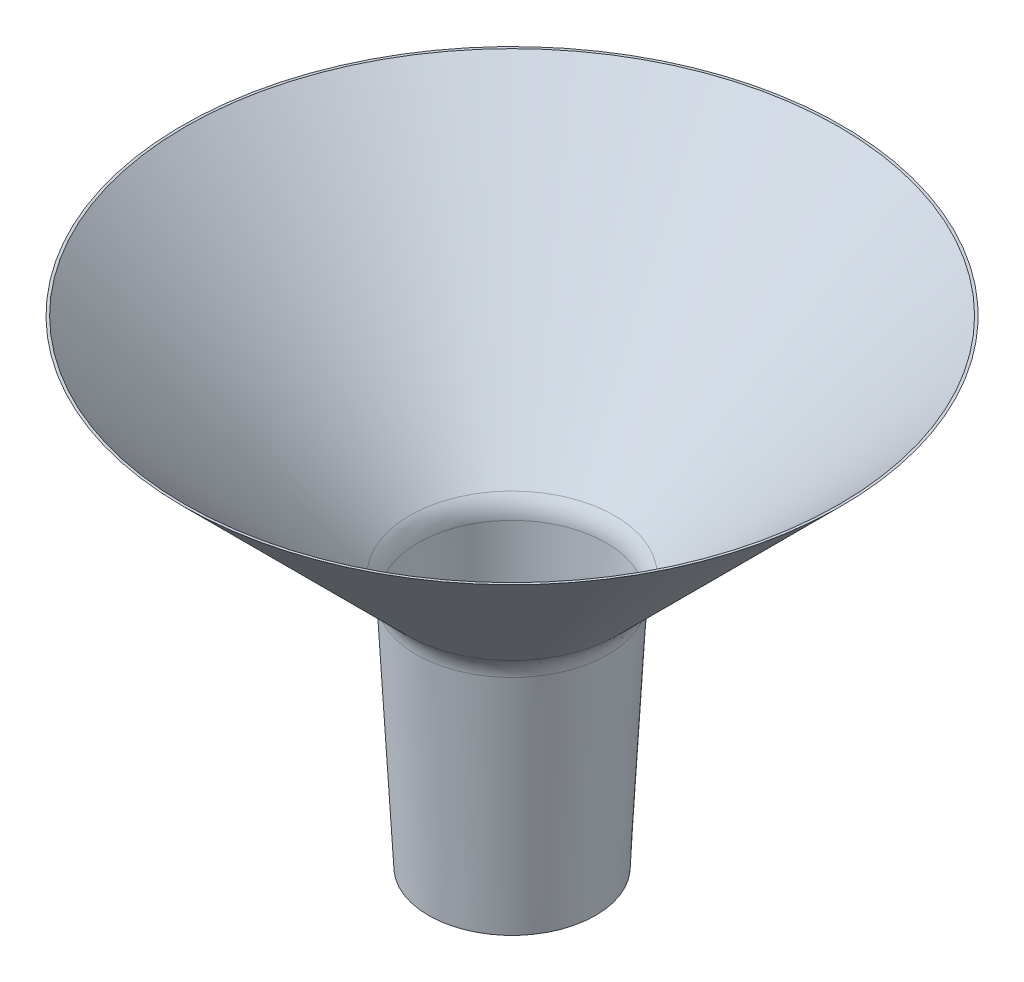
ISO-10303-21;
HEADER;
FILE_DESCRIPTION(('STEP AP214'),'2;1');
FILE_NAME('part.step','',(''),(''),'','','');
FILE_SCHEMA(('AUTOMOTIVE_DESIGN { 1 0 10303 214 1 1 1 1 }'));
ENDSEC;
DATA;
#1=APPLICATION_CONTEXT('core data for automotive mechanical design processes');
#2=APPLICATION_PROTOCOL_DEFINITION('international standard','automotive_design',2000,#1);
#3=PRODUCT_CONTEXT('',#1,'mechanical');
#4=PRODUCT('Part','Part','',(#3));
#5=PRODUCT_RELATED_PRODUCT_CATEGORY('part','',(#4));
#6=PRODUCT_DEFINITION_FORMATION('','',#4);
#7=PRODUCT_DEFINITION_CONTEXT('part definition',#1,'design');
#8=PRODUCT_DEFINITION('design','',#6,#7);
#9=PRODUCT_DEFINITION_SHAPE('','',#8);
#10=(LENGTH_UNIT() NAMED_UNIT(*) SI_UNIT(.MILLI.,.METRE.));
#11=(NAMED_UNIT(*) PLANE_ANGLE_UNIT() SI_UNIT($,.RADIAN.));
#12=(NAMED_UNIT(*) SI_UNIT($,.STERADIAN.) SOLID_ANGLE_UNIT());
#13=UNCERTAINTY_MEASURE_WITH_UNIT(LENGTH_MEASURE(1.E-05),#10,'distance_accuracy_value','');
#14=(GEOMETRIC_REPRESENTATION_CONTEXT(3) GLOBAL_UNCERTAINTY_ASSIGNED_CONTEXT((#13)) GLOBAL_UNIT_ASSIGNED_CONTEXT((#10,
#11,#12)) REPRESENTATION_CONTEXT('',''));
#15=CARTESIAN_POINT('',(0.,0.,0.));
#16=DIRECTION('',(0.,0.,1.));
#17=DIRECTION('',(1.,0.,0.));
#18=AXIS2_PLACEMENT_3D('',#15,#16,#17);
#19=CARTESIAN_POINT('',(25.5507547902989,0.,0.));
#20=DIRECTION('',(0.,-1.,0.));
#21=DIRECTION('',(0.,0.,-1.));
#22=AXIS2_PLACEMENT_3D('',#19,#20,#21);
#23=PLANE('',#22);
#24=CARTESIAN_POINT('',(0.,0.,0.));
#25=DIRECTION('',(0.,-1.,0.));
#26=DIRECTION('',(0.,0.,-1.));
#27=AXIS2_PLACEMENT_3D('',#24,#25,#26);
#28=CIRCLE('',#27,25.5507547902989);
#29=CARTESIAN_POINT('',(0.,0.,-25.5507547902989));
#30=VERTEX_POINT('',#29);
#31=EDGE_CURVE('E79',#30,#30,#28,.T.);
#32=ORIENTED_EDGE('',*,*,#31,.T.);
#33=EDGE_LOOP('',(#32));
#34=FACE_BOUND('',#33,.T.);
#35=CARTESIAN_POINT('',(0.,0.,0.));
#36=DIRECTION('',(0.,-1.,0.));
#37=DIRECTION('',(0.,0.,-1.));
#38=AXIS2_PLACEMENT_3D('',#35,#36,#37);
#39=CIRCLE('',#38,25.);
#40=CARTESIAN_POINT('',(0.,0.,-25.));
#41=VERTEX_POINT('',#40);
#42=EDGE_CURVE('E67',#41,#41,#39,.T.);
#43=ORIENTED_EDGE('',*,*,#42,.F.);
#44=EDGE_LOOP('',(#43));
#45=FACE_BOUND('',#44,.T.);
#46=ADVANCED_FACE('F43',(#34,#45),#23,.T.);
#47=CARTESIAN_POINT('',(0.,75.,0.));
#48=DIRECTION('',(0.,1.,0.));
#49=DIRECTION('',(0.,0.,1.));
#50=AXIS2_PLACEMENT_3D('',#47,#48,#49);
#51=CONICAL_SURFACE('',#50,28.9305834462279,0.0523598775598275);
#52=CARTESIAN_POINT('',(0.,71.5499583355522,0.));
#53=DIRECTION('',(0.,-1.,0.));
#54=DIRECTION('',(0.,0.,-1.));
#55=AXIS2_PLACEMENT_3D('',#52,#53,#54);
#56=CIRCLE('',#55,28.7497744241602);
#57=CARTESIAN_POINT('',(0.,71.5499583355522,-28.7497744241602));
#58=VERTEX_POINT('',#57);
#59=EDGE_CURVE('E10',#58,#58,#56,.F.);
#60=ORIENTED_EDGE('',*,*,#59,.T.);
#61=EDGE_LOOP('',(#60));
#62=FACE_BOUND('',#61,.T.);
#63=ORIENTED_EDGE('',*,*,#42,.T.);
#64=EDGE_LOOP('',(#63));
#65=FACE_BOUND('',#64,.T.);
#66=ADVANCED_FACE('F101',(#62,#65),#51,.F.);
#67=CARTESIAN_POINT('',(0.,146.069416553773,0.));
#68=DIRECTION('',(0.,1.,0.));
#69=DIRECTION('',(0.,0.,1.));
#70=AXIS2_PLACEMENT_3D('',#67,#68,#69);
#71=CONICAL_SURFACE('',#70,100.,0.785398163397443);
#72=CARTESIAN_POINT('',(0.,77.4428957600446,0.));
#73=DIRECTION('',(0.,-1.,0.));
#74=DIRECTION('',(0.,0.,-1.));
#75=AXIS2_PLACEMENT_3D('',#72,#73,#74);
#76=CIRCLE('',#75,31.3734792062725);
#77=CARTESIAN_POINT('',(0.,77.4428957600446,31.3734792062725));
#78=VERTEX_POINT('',#77);
#79=EDGE_CURVE('E51',#78,#78,#76,.T.);
#80=CARTESIAN_POINT('',(0.,146.069416553773,0.));
#81=DIRECTION('',(0.,-1.,0.));
#82=DIRECTION('',(0.,0.,-1.));
#83=AXIS2_PLACEMENT_3D('',#80,#81,#82);
#84=CIRCLE('',#83,100.);
#85=CARTESIAN_POINT('',(0.,146.069416553773,100.));
#86=VERTEX_POINT('',#85);
#87=EDGE_CURVE('E71',#86,#86,#84,.T.);
#88=CARTESIAN_POINT('',(0.,77.4428957600446,31.3734792062725));
#89=CARTESIAN_POINT('',(0.,78.1577553516459,32.0883387978738));
#90=CARTESIAN_POINT('',(0.,78.8726149432472,32.8031983894751));
#91=CARTESIAN_POINT('',(0.,80.3023341264499,34.2329175726778));
#92=CARTESIAN_POINT('',(0.,81.0171937180512,34.9477771642791));
#93=CARTESIAN_POINT('',(0.,82.4469129012539,36.3774963474818));
#94=CARTESIAN_POINT('',(0.,83.1617724928552,37.0923559390831));
#95=CARTESIAN_POINT('',(0.,84.5914916760579,38.5220751222857));
#96=CARTESIAN_POINT('',(0.,85.3063512676593,39.2369347138871));
#97=CARTESIAN_POINT('',(0.,86.7360704508619,40.6666538970897));
#98=CARTESIAN_POINT('',(0.,87.4509300424633,41.3815134886911));
#99=CARTESIAN_POINT('',(0.,88.8806492256659,42.8112326718937));
#100=CARTESIAN_POINT('',(0.,89.5955088172673,43.526092263495));
#101=CARTESIAN_POINT('',(0.,91.02522800047,44.9558114466977));
#102=CARTESIAN_POINT('',(0.,91.7400875920713,45.670671038299));
#103=CARTESIAN_POINT('',(0.,93.169806775274,47.1003902215017));
#104=CARTESIAN_POINT('',(0.,93.8846663668753,47.815249813103));
#105=CARTESIAN_POINT('',(0.,95.314385550078,49.2449689963057));
#106=CARTESIAN_POINT('',(0.,96.0292451416793,49.959828587907));
#107=CARTESIAN_POINT('',(0.,97.458964324882,51.3895477711097));
#108=CARTESIAN_POINT('',(0.,98.1738239164833,52.104407362711));
#109=CARTESIAN_POINT('',(0.,99.603543099686,53.5341265459137));
#110=CARTESIAN_POINT('',(0.,100.318402691287,54.248986137515));
#111=CARTESIAN_POINT('',(0.,101.74812187449,55.6787053207176));
#112=CARTESIAN_POINT('',(0.,102.462981466091,56.393564912319));
#113=CARTESIAN_POINT('',(0.,103.892700649294,57.8232840955216));
#114=CARTESIAN_POINT('',(0.,104.607560240895,58.538143687123));
#115=CARTESIAN_POINT('',(0.,106.037279424098,59.9678628703256));
#116=CARTESIAN_POINT('',(0.,106.752139015699,60.6827224619269));
#117=CARTESIAN_POINT('',(0.,108.181858198902,62.1124416451296));
#118=CARTESIAN_POINT('',(0.,108.896717790503,62.8273012367309));
#119=CARTESIAN_POINT('',(0.,110.326436973706,64.2570204199336));
#120=CARTESIAN_POINT('',(0.,111.041296565307,64.9718800115349));
#121=CARTESIAN_POINT('',(0.,112.47101574851,66.4015991947376));
#122=CARTESIAN_POINT('',(0.,113.185875340111,67.1164587863389));
#123=CARTESIAN_POINT('',(0.,114.615594523314,68.5461779695416));
#124=CARTESIAN_POINT('',(0.,115.330454114915,69.2610375611429));
#125=CARTESIAN_POINT('',(0.,116.760173298118,70.6907567443455));
#126=CARTESIAN_POINT('',(0.,117.475032889719,71.4056163359469));
#127=CARTESIAN_POINT('',(0.,118.904752072922,72.8353355191495));
#128=CARTESIAN_POINT('',(0.,119.619611664523,73.5501951107508));
#129=CARTESIAN_POINT('',(0.,121.049330847726,74.9799142939535));
#130=CARTESIAN_POINT('',(0.,121.764190439327,75.6947738855548));
#131=CARTESIAN_POINT('',(0.,123.19390962253,77.1244930687575));
#132=CARTESIAN_POINT('',(0.,123.908769214131,77.8393526603588));
#133=CARTESIAN_POINT('',(0.,125.338488397334,79.2690718435615));
#134=CARTESIAN_POINT('',(0.,126.053347988935,79.9839314351628));
#135=CARTESIAN_POINT('',(0.,127.483067172138,81.4136506183655));
#136=CARTESIAN_POINT('',(0.,128.197926763739,82.1285102099668));
#137=CARTESIAN_POINT('',(0.,129.627645946942,83.5582293931695));
#138=CARTESIAN_POINT('',(0.,130.342505538543,84.2730889847708));
#139=CARTESIAN_POINT('',(0.,131.772224721746,85.7028081679734));
#140=CARTESIAN_POINT('',(0.,132.487084313347,86.4176677595748));
#141=CARTESIAN_POINT('',(0.,133.91680349655,87.8473869427774));
#142=CARTESIAN_POINT('',(0.,134.631663088151,88.5622465343788));
#143=CARTESIAN_POINT('',(0.,136.061382271354,89.9919657175814));
#144=CARTESIAN_POINT('',(0.,136.776241862956,90.7068253091827));
#145=CARTESIAN_POINT('',(0.,138.205961046158,92.1365444923854));
#146=CARTESIAN_POINT('',(0.,138.92082063776,92.8514040839867));
#147=CARTESIAN_POINT('',(0.,140.350539820962,94.2811232671894));
#148=CARTESIAN_POINT('',(0.,141.065399412564,94.9959828587907));
#149=CARTESIAN_POINT('',(0.,142.495118595766,96.4257020419934));
#150=CARTESIAN_POINT('',(0.,143.209978187368,97.1405616335947));
#151=CARTESIAN_POINT('',(0.,144.63969737057,98.5702808167974));
#152=CARTESIAN_POINT('',(0.,145.354556962172,99.2851404083987));
#153=CARTESIAN_POINT('',(0.,146.069416553773,100.));
#154=B_SPLINE_CURVE_WITH_KNOTS('',3,(#88,#89,#90,#91,#92,#93,#94,#95,#96,#97,#98,#99,#100,#101,
#102,#103,#104,#105,#106,#107,#108,#109,#110,#111,#112,#113,#114,#115,#116,#117,#118,#119,#120,
#121,#122,#123,#124,#125,#126,#127,#128,#129,#130,#131,#132,#133,#134,#135,#136,#137,#138,#139,
#140,#141,#142,#143,#144,#145,#146,#147,#148,#149,#150,#151,#152,#153),.UNSPECIFIED.,.F.,.F.,(4,
2,2,2,2,2,2,2,2,2,2,2,2,2,2,2,2,2,2,2,2,2,2,2,2,2,2,2,2,2,2,2,4),(0.,3.03289238890529,
6.06578477781057,9.09867716671587,12.1315695556212,15.1644619445265,18.1973543334317,
21.230246722337,24.2631391112423,27.2960315001476,30.3289238890529,33.3618162779582,
36.3947086668635,39.4276010557688,42.4604934446741,45.4933858335794,48.5262782224846,
51.5591706113899,54.5920630002952,57.6249553892005,60.6578477781058,63.6907401670111,
66.7236325559164,69.7565249448217,72.789417333727,75.8223097226323,78.8552021115375,
81.8880945004428,84.9209868893481,87.9538792782534,90.9867716671587,94.019664056064,
97.0525564449693),.UNSPECIFIED.);
#155=EDGE_CURVE('BSEAM107',#78,#86,#154,.T.);
#156=ORIENTED_EDGE('',*,*,#79,.T.);
#157=ORIENTED_EDGE('',*,*,#87,.F.);
#158=ORIENTED_EDGE('',*,*,#155,.T.);
#159=ORIENTED_EDGE('',*,*,#155,.F.);
#160=EDGE_LOOP('',(#156,#158,#157,#159));
#161=FACE_BOUND('',#160,.T.);
#162=ADVANCED_FACE('F107',(#161),#71,.F.);
#163=CARTESIAN_POINT('',(100.,146.069416553773,0.));
#164=DIRECTION('',(0.,1.,0.));
#165=DIRECTION('',(0.,0.,1.));
#166=AXIS2_PLACEMENT_3D('',#163,#164,#165);
#167=PLANE('',#166);
#168=ORIENTED_EDGE('',*,*,#87,.T.);
#169=EDGE_LOOP('',(#168));
#170=FACE_BOUND('',#169,.T.);
#171=CARTESIAN_POINT('',(0.,146.069416553773,0.));
#172=DIRECTION('',(0.,-1.,0.));
#173=DIRECTION('',(0.,0.,-1.));
#174=AXIS2_PLACEMENT_3D('',#171,#172,#173);
#175=CIRCLE('',#174,100.777817459306);
#176=CARTESIAN_POINT('',(0.,146.069416553773,100.777817459306));
#177=VERTEX_POINT('',#176);
#178=EDGE_CURVE('E75',#177,#177,#175,.T.);
#179=ORIENTED_EDGE('',*,*,#178,.F.);
#180=EDGE_LOOP('',(#179));
#181=FACE_BOUND('',#180,.T.);
#182=ADVANCED_FACE('F97',(#170,#181),#167,.T.);
#183=CARTESIAN_POINT('',(0.,74.7603793445722,0.));
#184=DIRECTION('',(0.,1.,0.));
#185=DIRECTION('',(0.,0.,1.));
#186=AXIS2_PLACEMENT_3D('',#183,#184,#185);
#187=CONICAL_SURFACE('',#186,29.4687802501053,0.785398163397445);
#188=CARTESIAN_POINT('',(0.,77.474707966844,0.));
#189=DIRECTION('',(0.,1.,0.));
#190=DIRECTION('',(0.,0.,1.));
#191=AXIS2_PLACEMENT_3D('',#188,#189,#190);
#192=CIRCLE('',#191,32.1831088723771);
#193=CARTESIAN_POINT('',(0.,77.474707966844,32.1831088723771));
#194=VERTEX_POINT('',#193);
#195=EDGE_CURVE('E56',#194,#194,#192,.T.);
#196=CARTESIAN_POINT('',(0.,77.474707966844,32.1831088723771));
#197=CARTESIAN_POINT('',(0.,78.1892361812912,32.8976370868242));
#198=CARTESIAN_POINT('',(0.,78.9037643957383,33.6121653012714));
#199=CARTESIAN_POINT('',(0.,80.3328208246327,35.0412217301658));
#200=CARTESIAN_POINT('',(0.,81.0473490390798,35.7557499446129));
#201=CARTESIAN_POINT('',(0.,82.4764054679742,37.1848063735073));
#202=CARTESIAN_POINT('',(0.,83.1909336824214,37.8993345879544));
#203=CARTESIAN_POINT('',(0.,84.6199901113157,39.3283910168488));
#204=CARTESIAN_POINT('',(0.,85.3345183257629,40.042919231296));
#205=CARTESIAN_POINT('',(0.,86.7635747546573,41.4719756601903));
#206=CARTESIAN_POINT('',(0.,87.4781029691044,42.1865038746375));
#207=CARTESIAN_POINT('',(0.,88.9071593979988,43.6155603035318));
#208=CARTESIAN_POINT('',(0.,89.621687612446,44.330088517979));
#209=CARTESIAN_POINT('',(0.,91.0507440413403,45.7591449468733));
#210=CARTESIAN_POINT('',(0.,91.7652722557875,46.4736731613205));
#211=CARTESIAN_POINT('',(0.,93.1943286846818,47.9027295902149));
#212=CARTESIAN_POINT('',(0.,93.908856899129,48.617257804662));
#213=CARTESIAN_POINT('',(0.,95.3379133280234,50.0463142335564));
#214=CARTESIAN_POINT('',(0.,96.0524415424706,50.7608424480035));
#215=CARTESIAN_POINT('',(0.,97.4814979713649,52.1898988768979));
#216=CARTESIAN_POINT('',(0.,98.1960261858121,52.904427091345));
#217=CARTESIAN_POINT('',(0.,99.6250826147064,54.3334835202394));
#218=CARTESIAN_POINT('',(0.,100.339610829154,55.0480117346866));
#219=CARTESIAN_POINT('',(0.,101.768667258048,56.4770681635809));
#220=CARTESIAN_POINT('',(0.,102.483195472495,57.1915963780281));
#221=CARTESIAN_POINT('',(0.,103.912251901389,58.6206528069224));
#222=CARTESIAN_POINT('',(0.,104.626780115837,59.3351810213696));
#223=CARTESIAN_POINT('',(0.,106.055836544731,60.7642374502639));
#224=CARTESIAN_POINT('',(0.,106.770364759178,61.4787656647111));
#225=CARTESIAN_POINT('',(0.,108.199421188073,62.9078220936055));
#226=CARTESIAN_POINT('',(0.,108.91394940252,63.6223503080526));
#227=CARTESIAN_POINT('',(0.,110.343005831414,65.051406736947));
#228=CARTESIAN_POINT('',(0.,111.057534045861,65.7659349513941));
#229=CARTESIAN_POINT('',(0.,112.486590474756,67.1949913802885));
#230=CARTESIAN_POINT('',(0.,113.201118689203,67.9095195947357));
#231=CARTESIAN_POINT('',(0.,114.630175118097,69.33857602363));
#232=CARTESIAN_POINT('',(0.,115.344703332544,70.0531042380772));
#233=CARTESIAN_POINT('',(0.,116.773759761439,71.4821606669715));
#234=CARTESIAN_POINT('',(0.,117.488287975886,72.1966888814187));
#235=CARTESIAN_POINT('',(0.,118.91734440478,73.6257453103131));
#236=CARTESIAN_POINT('',(0.,119.631872619227,74.3402735247602));
#237=CARTESIAN_POINT('',(0.,121.060929048122,75.7693299536545));
#238=CARTESIAN_POINT('',(0.,121.775457262569,76.4838581681017));
#239=CARTESIAN_POINT('',(0.,123.204513691463,77.9129145969961));
#240=CARTESIAN_POINT('',(0.,123.91904190591,78.6274428114432));
#241=CARTESIAN_POINT('',(0.,125.348098334805,80.0564992403376));
#242=CARTESIAN_POINT('',(0.,126.062626549252,80.7710274547848));
#243=CARTESIAN_POINT('',(0.,127.491682978146,82.2000838836791));
#244=CARTESIAN_POINT('',(0.,128.206211192593,82.9146120981263));
#245=CARTESIAN_POINT('',(0.,129.635267621488,84.3436685270206));
#246=CARTESIAN_POINT('',(0.,130.349795835935,85.0581967414678));
#247=CARTESIAN_POINT('',(0.,131.778852264829,86.4872531703621));
#248=CARTESIAN_POINT('',(0.,132.493380479277,87.2017813848093));
#249=CARTESIAN_POINT('',(0.,133.922436908171,88.6308378137036));
#250=CARTESIAN_POINT('',(0.,134.636965122618,89.3453660281508));
#251=CARTESIAN_POINT('',(0.,136.066021551512,90.7744224570452));
#252=CARTESIAN_POINT('',(0.,136.78054976596,91.4889506714923));
#253=CARTESIAN_POINT('',(0.,138.209606194854,92.9180071003867));
#254=CARTESIAN_POINT('',(0.,138.924134409301,93.6325353148338));
#255=CARTESIAN_POINT('',(0.,140.353190838195,95.0615917437282));
#256=CARTESIAN_POINT('',(0.,141.067719052643,95.7761199581754));
#257=CARTESIAN_POINT('',(0.,142.496775481537,97.2051763870697));
#258=CARTESIAN_POINT('',(0.,143.211303695984,97.9197046015169));
#259=CARTESIAN_POINT('',(0.,144.640360124879,99.3487610304113));
#260=CARTESIAN_POINT('',(0.,145.354888339326,100.063289244858));
#261=CARTESIAN_POINT('',(0.,146.069416553773,100.777817459306));
#262=B_SPLINE_CURVE_WITH_KNOTS('',3,(#196,#197,#198,#199,#200,#201,#202,#203,#204,#205,#206,
#207,#208,#209,#210,#211,#212,#213,#214,#215,#216,#217,#218,#219,#220,#221,#222,#223,#224,#225,
#226,#227,#228,#229,#230,#231,#232,#233,#234,#235,#236,#237,#238,#239,#240,#241,#242,#243,#244,
#245,#246,#247,#248,#249,#250,#251,#252,#253,#254,#255,#256,#257,#258,#259,#260,#261),
.UNSPECIFIED.,.F.,.F.,(4,2,2,2,2,2,2,2,2,2,2,2,2,2,2,2,2,2,2,2,2,2,2,2,2,2,2,2,2,2,2,2,4),(0.,
3.03148647470827,6.06297294941654,9.09445942412482,12.1259458988331,15.1574323735414,
18.1889188482496,21.2204053229579,24.2518917976662,27.2833782723745,30.3148647470827,
33.346351221791,36.3778376964993,39.4093241712076,42.4408106459158,45.4722971206241,
48.5037835953324,51.5352700700407,54.5667565447489,57.5982430194572,60.6297294941655,
63.6612159688737,66.692702443582,69.7241889182903,72.7556753929986,75.7871618677068,
78.8186483424151,81.8501348171234,84.8816212918317,87.91310776654,90.9445942412482,
93.9760807159565,97.0075671906648),.UNSPECIFIED.);
#263=EDGE_CURVE('BSEAM89',#194,#177,#262,.T.);
#264=ORIENTED_EDGE('',*,*,#195,.T.);
#265=ORIENTED_EDGE('',*,*,#178,.T.);
#266=ORIENTED_EDGE('',*,*,#263,.T.);
#267=ORIENTED_EDGE('',*,*,#263,.F.);
#268=EDGE_LOOP('',(#264,#266,#265,#267));
#269=FACE_BOUND('',#268,.T.);
#270=ADVANCED_FACE('F89',(#269),#187,.T.);
#271=CARTESIAN_POINT('',(0.,0.,0.));
#272=DIRECTION('',(0.,1.,0.));
#273=DIRECTION('',(0.,0.,1.));
#274=AXIS2_PLACEMENT_3D('',#271,#272,#273);
#275=CONICAL_SURFACE('',#274,25.5507547902989,0.052359877559826);
#276=CARTESIAN_POINT('',(0.,70.9269997174079,0.));
#277=DIRECTION('',(0.,1.,0.));
#278=DIRECTION('',(0.,0.,1.));
#279=AXIS2_PLACEMENT_3D('',#276,#277,#278);
#280=CIRCLE('',#279,29.2678813366968);
#281=CARTESIAN_POINT('',(0.,70.9269997174079,29.2678813366968));
#282=VERTEX_POINT('',#281);
#283=EDGE_CURVE('E61',#282,#282,#280,.F.);
#284=ORIENTED_EDGE('',*,*,#283,.T.);
#285=EDGE_LOOP('',(#284));
#286=FACE_BOUND('',#285,.T.);
#287=ORIENTED_EDGE('',*,*,#31,.F.);
#288=EDGE_LOOP('',(#287));
#289=FACE_BOUND('',#288,.T.);
#290=ADVANCED_FACE('F86',(#286,#289),#275,.T.);
#291=CARTESIAN_POINT('',(0.,70.4036401549785,0.));
#292=DIRECTION('',(0.,-1.,0.));
#293=DIRECTION('',(0.,0.,-1.));
#294=AXIS2_PLACEMENT_3D('',#291,#292,#293);
#295=TOROIDAL_SURFACE('',#294,39.2541766842426,10.);
#296=ORIENTED_EDGE('',*,*,#195,.F.);
#297=EDGE_LOOP('',(#296));
#298=FACE_BOUND('',#297,.T.);
#299=ORIENTED_EDGE('',*,*,#283,.F.);
#300=EDGE_LOOP('',(#299));
#301=FACE_BOUND('',#300,.T.);
#302=ADVANCED_FACE('F88',(#298,#301),#295,.F.);
#303=CARTESIAN_POINT('',(0.,71.0789347293657,0.));
#304=DIRECTION('',(0.,1.,0.));
#305=DIRECTION('',(0.,0.,1.));
#306=AXIS2_PLACEMENT_3D('',#303,#304,#305);
#307=TOROIDAL_SURFACE('',#306,37.7374402369514,9.);
#308=ORIENTED_EDGE('',*,*,#59,.F.);
#309=EDGE_LOOP('',(#308));
#310=FACE_BOUND('',#309,.T.);
#311=ORIENTED_EDGE('',*,*,#79,.F.);
#312=EDGE_LOOP('',(#311));
#313=FACE_BOUND('',#312,.T.);
#314=ADVANCED_FACE('F45',(#310,#313),#307,.T.);
#315=CLOSED_SHELL('',(#46,#66,#162,#182,#270,#290,#302,#314));
#316=MANIFOLD_SOLID_BREP('B2',#315);
#317=ADVANCED_BREP_SHAPE_REPRESENTATION('',(#18,#316),#14);
#318=SHAPE_DEFINITION_REPRESENTATION(#9,#317);
ENDSEC;
END-ISO-10303-21;
